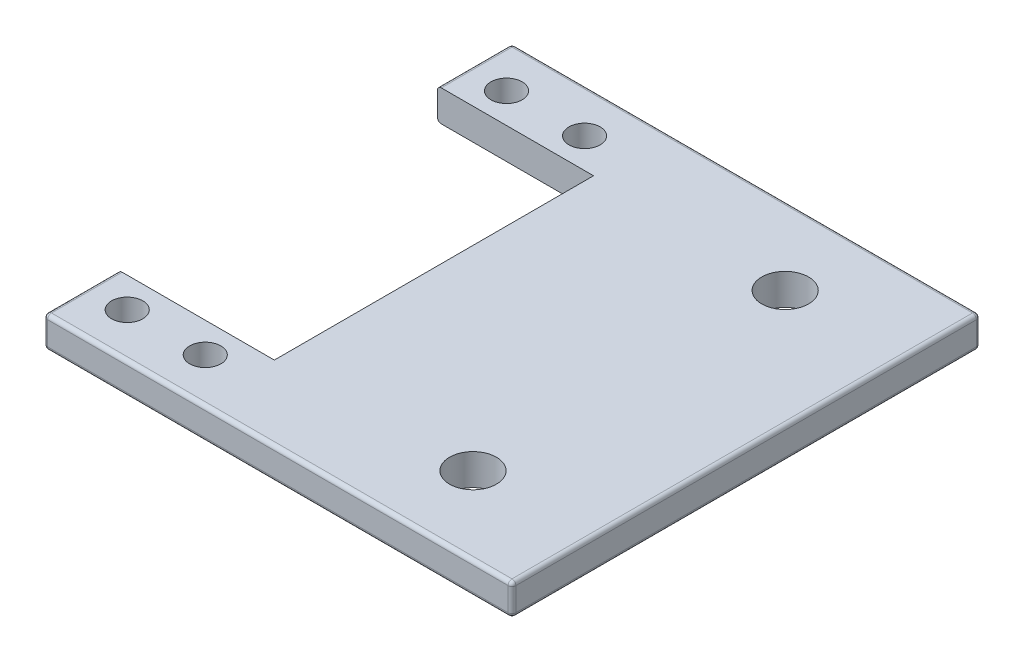
ISO-10303-21;
HEADER;
FILE_DESCRIPTION(('STEP AP214'),'2;1');
FILE_NAME('part.step','',(''),(''),'','','');
FILE_SCHEMA(('AUTOMOTIVE_DESIGN { 1 0 10303 214 1 1 1 1 }'));
ENDSEC;
DATA;
#1=APPLICATION_CONTEXT('core data for automotive mechanical design processes');
#2=APPLICATION_PROTOCOL_DEFINITION('international standard','automotive_design',2000,#1);
#3=PRODUCT_CONTEXT('',#1,'mechanical');
#4=PRODUCT('Part','Part','',(#3));
#5=PRODUCT_RELATED_PRODUCT_CATEGORY('part','',(#4));
#6=PRODUCT_DEFINITION_FORMATION('','',#4);
#7=PRODUCT_DEFINITION_CONTEXT('part definition',#1,'design');
#8=PRODUCT_DEFINITION('design','',#6,#7);
#9=PRODUCT_DEFINITION_SHAPE('','',#8);
#10=(LENGTH_UNIT() NAMED_UNIT(*) SI_UNIT(.MILLI.,.METRE.));
#11=(NAMED_UNIT(*) PLANE_ANGLE_UNIT() SI_UNIT($,.RADIAN.));
#12=(NAMED_UNIT(*) SI_UNIT($,.STERADIAN.) SOLID_ANGLE_UNIT());
#13=UNCERTAINTY_MEASURE_WITH_UNIT(LENGTH_MEASURE(1.E-05),#10,'distance_accuracy_value','');
#14=(GEOMETRIC_REPRESENTATION_CONTEXT(3) GLOBAL_UNCERTAINTY_ASSIGNED_CONTEXT((#13)) GLOBAL_UNIT_ASSIGNED_CONTEXT((#10,
#11,#12)) REPRESENTATION_CONTEXT('',''));
#15=CARTESIAN_POINT('',(0.,0.,0.));
#16=DIRECTION('',(0.,0.,1.));
#17=DIRECTION('',(1.,0.,0.));
#18=AXIS2_PLACEMENT_3D('',#15,#16,#17);
#19=CARTESIAN_POINT('',(0.,2.,-20.45));
#20=DIRECTION('',(0.,0.,-1.));
#21=DIRECTION('',(-1.,0.,0.));
#22=AXIS2_PLACEMENT_3D('',#19,#20,#21);
#23=PLANE('',#22);
#24=DIRECTION('',(0.,-1.,0.));
#25=VECTOR('',#24,1.);
#26=CARTESIAN_POINT('',(-30.,2.,-20.45));
#27=LINE('',#26,#25);
#28=CARTESIAN_POINT('',(-30.,1.5,-20.45));
#29=VERTEX_POINT('',#28);
#30=CARTESIAN_POINT('',(-30.,-1.5,-20.45));
#31=VERTEX_POINT('',#30);
#32=EDGE_CURVE('E364',#29,#31,#27,.T.);
#33=ORIENTED_EDGE('',*,*,#32,.T.);
#34=CARTESIAN_POINT('',(-29.5,-1.5,-20.45));
#35=DIRECTION('',(0.,0.,-1.));
#36=DIRECTION('',(-1.,0.,0.));
#37=AXIS2_PLACEMENT_3D('',#34,#35,#36);
#38=CIRCLE('',#37,0.5);
#39=CARTESIAN_POINT('',(-29.5,-2.,-20.45));
#40=VERTEX_POINT('',#39);
#41=EDGE_CURVE('E11',#31,#40,#38,.F.);
#42=ORIENTED_EDGE('',*,*,#41,.T.);
#43=DIRECTION('',(1.,0.,0.));
#44=VECTOR('',#43,1.);
#45=CARTESIAN_POINT('',(0.,-2.,-20.45));
#46=LINE('',#45,#44);
#47=CARTESIAN_POINT('',(-10.,-2.,-20.45));
#48=VERTEX_POINT('',#47);
#49=EDGE_CURVE('E194',#40,#48,#46,.T.);
#50=ORIENTED_EDGE('',*,*,#49,.T.);
#51=DIRECTION('',(0.,-1.,0.));
#52=VECTOR('',#51,1.);
#53=CARTESIAN_POINT('',(-10.,2.,-20.45));
#54=LINE('',#53,#52);
#55=CARTESIAN_POINT('',(-10.,2.,-20.45));
#56=VERTEX_POINT('',#55);
#57=EDGE_CURVE('E187',#56,#48,#54,.T.);
#58=ORIENTED_EDGE('',*,*,#57,.F.);
#59=DIRECTION('',(1.,0.,0.));
#60=VECTOR('',#59,1.);
#61=CARTESIAN_POINT('',(0.,2.,-20.45));
#62=LINE('',#61,#60);
#63=CARTESIAN_POINT('',(-29.5,2.,-20.45));
#64=VERTEX_POINT('',#63);
#65=EDGE_CURVE('E170',#64,#56,#62,.T.);
#66=ORIENTED_EDGE('',*,*,#65,.F.);
#67=CARTESIAN_POINT('',(-29.5,1.5,-20.45));
#68=DIRECTION('',(0.,0.,-1.));
#69=DIRECTION('',(-1.,0.,0.));
#70=AXIS2_PLACEMENT_3D('',#67,#68,#69);
#71=CIRCLE('',#70,0.5);
#72=EDGE_CURVE('E54',#64,#29,#71,.F.);
#73=ORIENTED_EDGE('',*,*,#72,.T.);
#74=EDGE_LOOP('',(#33,#42,#50,#58,#66,#73));
#75=FACE_BOUND('',#74,.T.);
#76=ADVANCED_FACE('F45',(#75),#23,.F.);
#77=CARTESIAN_POINT('',(-10.,2.,0.));
#78=DIRECTION('',(1.,0.,0.));
#79=DIRECTION('',(0.,0.,-1.));
#80=AXIS2_PLACEMENT_3D('',#77,#78,#79);
#81=PLANE('',#80);
#82=DIRECTION('',(0.,0.,1.));
#83=VECTOR('',#82,1.);
#84=CARTESIAN_POINT('',(-10.,-2.,0.));
#85=LINE('',#84,#83);
#86=CARTESIAN_POINT('',(-10.,-2.,20.45));
#87=VERTEX_POINT('',#86);
#88=EDGE_CURVE('E359',#48,#87,#85,.T.);
#89=ORIENTED_EDGE('',*,*,#88,.T.);
#90=DIRECTION('',(0.,-1.,0.));
#91=VECTOR('',#90,1.);
#92=CARTESIAN_POINT('',(-10.,2.,20.45));
#93=LINE('',#92,#91);
#94=CARTESIAN_POINT('',(-10.,2.,20.45));
#95=VERTEX_POINT('',#94);
#96=EDGE_CURVE('E189',#95,#87,#93,.T.);
#97=ORIENTED_EDGE('',*,*,#96,.F.);
#98=DIRECTION('',(0.,0.,1.));
#99=VECTOR('',#98,1.);
#100=CARTESIAN_POINT('',(-10.,2.,0.));
#101=LINE('',#100,#99);
#102=EDGE_CURVE('E174',#56,#95,#101,.T.);
#103=ORIENTED_EDGE('',*,*,#102,.F.);
#104=ORIENTED_EDGE('',*,*,#57,.T.);
#105=EDGE_LOOP('',(#89,#97,#103,#104));
#106=FACE_BOUND('',#105,.T.);
#107=ADVANCED_FACE('F186',(#106),#81,.F.);
#108=CARTESIAN_POINT('',(0.,2.,20.45));
#109=DIRECTION('',(0.,0.,-1.));
#110=DIRECTION('',(-1.,0.,0.));
#111=AXIS2_PLACEMENT_3D('',#108,#109,#110);
#112=PLANE('',#111);
#113=DIRECTION('',(1.,0.,0.));
#114=VECTOR('',#113,1.);
#115=CARTESIAN_POINT('',(0.,-2.,20.45));
#116=LINE('',#115,#114);
#117=CARTESIAN_POINT('',(-29.5,-2.,20.45));
#118=VERTEX_POINT('',#117);
#119=EDGE_CURVE('E361',#118,#87,#116,.T.);
#120=ORIENTED_EDGE('',*,*,#119,.F.);
#121=CARTESIAN_POINT('',(-29.5,-1.5,20.45));
#122=DIRECTION('',(0.,0.,-1.));
#123=DIRECTION('',(-1.,0.,0.));
#124=AXIS2_PLACEMENT_3D('',#121,#122,#123);
#125=CIRCLE('',#124,0.5);
#126=CARTESIAN_POINT('',(-30.,-1.5,20.45));
#127=VERTEX_POINT('',#126);
#128=EDGE_CURVE('E260',#118,#127,#125,.T.);
#129=ORIENTED_EDGE('',*,*,#128,.T.);
#130=DIRECTION('',(0.,-1.,0.));
#131=VECTOR('',#130,1.);
#132=CARTESIAN_POINT('',(-30.,2.,20.45));
#133=LINE('',#132,#131);
#134=CARTESIAN_POINT('',(-30.,1.5,20.45));
#135=VERTEX_POINT('',#134);
#136=EDGE_CURVE('E199',#135,#127,#133,.T.);
#137=ORIENTED_EDGE('',*,*,#136,.F.);
#138=CARTESIAN_POINT('',(-29.5,1.5,20.45));
#139=DIRECTION('',(0.,0.,-1.));
#140=DIRECTION('',(-1.,0.,0.));
#141=AXIS2_PLACEMENT_3D('',#138,#139,#140);
#142=CIRCLE('',#141,0.5);
#143=CARTESIAN_POINT('',(-29.5,2.,20.45));
#144=VERTEX_POINT('',#143);
#145=EDGE_CURVE('E258',#135,#144,#142,.T.);
#146=ORIENTED_EDGE('',*,*,#145,.T.);
#147=DIRECTION('',(1.,0.,0.));
#148=VECTOR('',#147,1.);
#149=CARTESIAN_POINT('',(0.,2.,20.45));
#150=LINE('',#149,#148);
#151=EDGE_CURVE('E190',#144,#95,#150,.T.);
#152=ORIENTED_EDGE('',*,*,#151,.T.);
#153=ORIENTED_EDGE('',*,*,#96,.T.);
#154=EDGE_LOOP('',(#120,#129,#137,#146,#152,#153));
#155=FACE_BOUND('',#154,.T.);
#156=ADVANCED_FACE('F388',(#155),#112,.T.);
#157=CARTESIAN_POINT('',(-30.,2.,0.));
#158=DIRECTION('',(-1.,0.,0.));
#159=DIRECTION('',(0.,0.,1.));
#160=AXIS2_PLACEMENT_3D('',#157,#158,#159);
#161=PLANE('',#160);
#162=ORIENTED_EDGE('',*,*,#136,.T.);
#163=DIRECTION('',(0.,0.,-1.));
#164=VECTOR('',#163,1.);
#165=CARTESIAN_POINT('',(-30.,-1.5,30.));
#166=LINE('',#165,#164);
#167=CARTESIAN_POINT('',(-30.,-1.5,29.5));
#168=VERTEX_POINT('',#167);
#169=EDGE_CURVE('E243',#127,#168,#166,.F.);
#170=ORIENTED_EDGE('',*,*,#169,.T.);
#171=DIRECTION('',(0.,-1.,0.));
#172=VECTOR('',#171,1.);
#173=CARTESIAN_POINT('',(-30.,2.,29.5));
#174=LINE('',#173,#172);
#175=CARTESIAN_POINT('',(-30.,1.5,29.5));
#176=VERTEX_POINT('',#175);
#177=EDGE_CURVE('E241',#168,#176,#174,.F.);
#178=ORIENTED_EDGE('',*,*,#177,.T.);
#179=DIRECTION('',(0.,0.,-1.));
#180=VECTOR('',#179,1.);
#181=CARTESIAN_POINT('',(-30.,1.5,0.));
#182=LINE('',#181,#180);
#183=EDGE_CURVE('E239',#176,#135,#182,.T.);
#184=ORIENTED_EDGE('',*,*,#183,.T.);
#185=EDGE_LOOP('',(#162,#170,#178,#184));
#186=FACE_BOUND('',#185,.T.);
#187=ADVANCED_FACE('F369',(#186),#161,.T.);
#188=CARTESIAN_POINT('',(0.,2.,30.));
#189=DIRECTION('',(0.,0.,-1.));
#190=DIRECTION('',(-1.,0.,0.));
#191=AXIS2_PLACEMENT_3D('',#188,#189,#190);
#192=PLANE('',#191);
#193=DIRECTION('',(1.,0.,0.));
#194=VECTOR('',#193,1.);
#195=CARTESIAN_POINT('',(-30.,1.5,30.));
#196=LINE('',#195,#194);
#197=CARTESIAN_POINT('',(29.5,1.5,30.));
#198=VERTEX_POINT('',#197);
#199=CARTESIAN_POINT('',(-29.5,1.5,30.));
#200=VERTEX_POINT('',#199);
#201=EDGE_CURVE('E234',#198,#200,#196,.F.);
#202=ORIENTED_EDGE('',*,*,#201,.T.);
#203=DIRECTION('',(0.,-1.,0.));
#204=VECTOR('',#203,1.);
#205=CARTESIAN_POINT('',(-29.5,-2.,30.));
#206=LINE('',#205,#204);
#207=CARTESIAN_POINT('',(-29.5,-1.5,30.));
#208=VERTEX_POINT('',#207);
#209=EDGE_CURVE('E236',#200,#208,#206,.T.);
#210=ORIENTED_EDGE('',*,*,#209,.T.);
#211=DIRECTION('',(1.,0.,0.));
#212=VECTOR('',#211,1.);
#213=CARTESIAN_POINT('',(0.,-1.5,30.));
#214=LINE('',#213,#212);
#215=CARTESIAN_POINT('',(29.5,-1.5,30.));
#216=VERTEX_POINT('',#215);
#217=EDGE_CURVE('E230',#208,#216,#214,.T.);
#218=ORIENTED_EDGE('',*,*,#217,.T.);
#219=DIRECTION('',(0.,-1.,0.));
#220=VECTOR('',#219,1.);
#221=CARTESIAN_POINT('',(29.5,2.,30.));
#222=LINE('',#221,#220);
#223=EDGE_CURVE('E232',#216,#198,#222,.F.);
#224=ORIENTED_EDGE('',*,*,#223,.T.);
#225=EDGE_LOOP('',(#202,#210,#218,#224));
#226=FACE_BOUND('',#225,.T.);
#227=ADVANCED_FACE('F465',(#226),#192,.F.);
#228=CARTESIAN_POINT('',(30.,2.,0.));
#229=DIRECTION('',(-1.,0.,0.));
#230=DIRECTION('',(0.,0.,1.));
#231=AXIS2_PLACEMENT_3D('',#228,#229,#230);
#232=PLANE('',#231);
#233=DIRECTION('',(0.,0.,-1.));
#234=VECTOR('',#233,1.);
#235=CARTESIAN_POINT('',(30.,1.5,30.));
#236=LINE('',#235,#234);
#237=CARTESIAN_POINT('',(30.,1.5,-29.5));
#238=VERTEX_POINT('',#237);
#239=CARTESIAN_POINT('',(30.,1.5,29.5));
#240=VERTEX_POINT('',#239);
#241=EDGE_CURVE('E215',#238,#240,#236,.F.);
#242=ORIENTED_EDGE('',*,*,#241,.T.);
#243=DIRECTION('',(0.,-1.,0.));
#244=VECTOR('',#243,1.);
#245=CARTESIAN_POINT('',(30.,2.,29.5));
#246=LINE('',#245,#244);
#247=CARTESIAN_POINT('',(30.,-1.5,29.5));
#248=VERTEX_POINT('',#247);
#249=EDGE_CURVE('E218',#240,#248,#246,.T.);
#250=ORIENTED_EDGE('',*,*,#249,.T.);
#251=DIRECTION('',(0.,0.,-1.));
#252=VECTOR('',#251,1.);
#253=CARTESIAN_POINT('',(30.,-1.5,0.));
#254=LINE('',#253,#252);
#255=CARTESIAN_POINT('',(30.,-1.5,-29.5));
#256=VERTEX_POINT('',#255);
#257=EDGE_CURVE('E213',#248,#256,#254,.T.);
#258=ORIENTED_EDGE('',*,*,#257,.T.);
#259=DIRECTION('',(0.,-1.,0.));
#260=VECTOR('',#259,1.);
#261=CARTESIAN_POINT('',(30.,2.,-29.5));
#262=LINE('',#261,#260);
#263=EDGE_CURVE('E211',#256,#238,#262,.F.);
#264=ORIENTED_EDGE('',*,*,#263,.T.);
#265=EDGE_LOOP('',(#242,#250,#258,#264));
#266=FACE_BOUND('',#265,.T.);
#267=ADVANCED_FACE('F585',(#266),#232,.F.);
#268=CARTESIAN_POINT('',(0.,2.,-30.));
#269=DIRECTION('',(0.,0.,-1.));
#270=DIRECTION('',(-1.,0.,0.));
#271=AXIS2_PLACEMENT_3D('',#268,#269,#270);
#272=PLANE('',#271);
#273=DIRECTION('',(1.,0.,0.));
#274=VECTOR('',#273,1.);
#275=CARTESIAN_POINT('',(0.,1.5,-30.));
#276=LINE('',#275,#274);
#277=CARTESIAN_POINT('',(-29.5,1.5,-30.));
#278=VERTEX_POINT('',#277);
#279=CARTESIAN_POINT('',(29.5,1.5,-30.));
#280=VERTEX_POINT('',#279);
#281=EDGE_CURVE('E249',#278,#280,#276,.T.);
#282=ORIENTED_EDGE('',*,*,#281,.T.);
#283=DIRECTION('',(0.,-1.,0.));
#284=VECTOR('',#283,1.);
#285=CARTESIAN_POINT('',(29.5,-2.,-30.));
#286=LINE('',#285,#284);
#287=CARTESIAN_POINT('',(29.5,-1.5,-30.));
#288=VERTEX_POINT('',#287);
#289=EDGE_CURVE('E251',#280,#288,#286,.T.);
#290=ORIENTED_EDGE('',*,*,#289,.T.);
#291=DIRECTION('',(1.,0.,0.));
#292=VECTOR('',#291,1.);
#293=CARTESIAN_POINT('',(-30.,-1.5,-30.));
#294=LINE('',#293,#292);
#295=CARTESIAN_POINT('',(-29.5,-1.5,-30.));
#296=VERTEX_POINT('',#295);
#297=EDGE_CURVE('E245',#288,#296,#294,.F.);
#298=ORIENTED_EDGE('',*,*,#297,.T.);
#299=DIRECTION('',(0.,-1.,0.));
#300=VECTOR('',#299,1.);
#301=CARTESIAN_POINT('',(-29.5,2.,-30.));
#302=LINE('',#301,#300);
#303=EDGE_CURVE('E247',#296,#278,#302,.F.);
#304=ORIENTED_EDGE('',*,*,#303,.T.);
#305=EDGE_LOOP('',(#282,#290,#298,#304));
#306=FACE_BOUND('',#305,.T.);
#307=ADVANCED_FACE('F478',(#306),#272,.T.);
#308=CARTESIAN_POINT('',(-25.,2.,-24.3));
#309=DIRECTION('',(0.,-1.,0.));
#310=DIRECTION('',(0.,0.,-1.));
#311=AXIS2_PLACEMENT_3D('',#308,#309,#310);
#312=CYLINDRICAL_SURFACE('',#311,2.00000000000001);
#313=CARTESIAN_POINT('',(-25.,2.,-24.3));
#314=DIRECTION('',(0.,1.,0.));
#315=DIRECTION('',(0.,0.,1.));
#316=AXIS2_PLACEMENT_3D('',#313,#314,#315);
#317=CIRCLE('',#316,2.00000000000001);
#318=CARTESIAN_POINT('',(-25.,2.,-22.3));
#319=VERTEX_POINT('',#318);
#320=EDGE_CURVE('E181',#319,#319,#317,.T.);
#321=ORIENTED_EDGE('',*,*,#320,.T.);
#322=EDGE_LOOP('',(#321));
#323=FACE_BOUND('',#322,.T.);
#324=CARTESIAN_POINT('',(-25.,-2.,-24.3));
#325=DIRECTION('',(0.,1.,0.));
#326=DIRECTION('',(0.,0.,1.));
#327=AXIS2_PLACEMENT_3D('',#324,#325,#326);
#328=CIRCLE('',#327,2.00000000000001);
#329=CARTESIAN_POINT('',(-25.,-2.,-22.3));
#330=VERTEX_POINT('',#329);
#331=EDGE_CURVE('E355',#330,#330,#328,.T.);
#332=ORIENTED_EDGE('',*,*,#331,.F.);
#333=EDGE_LOOP('',(#332));
#334=FACE_BOUND('',#333,.T.);
#335=ADVANCED_FACE('F474',(#323,#334),#312,.F.);
#336=CARTESIAN_POINT('',(-15.,2.,-24.3));
#337=DIRECTION('',(0.,-1.,0.));
#338=DIRECTION('',(0.,0.,-1.));
#339=AXIS2_PLACEMENT_3D('',#336,#337,#338);
#340=CYLINDRICAL_SURFACE('',#339,2.);
#341=CARTESIAN_POINT('',(-15.,2.,-24.3));
#342=DIRECTION('',(0.,1.,0.));
#343=DIRECTION('',(0.,0.,1.));
#344=AXIS2_PLACEMENT_3D('',#341,#342,#343);
#345=CIRCLE('',#344,2.);
#346=CARTESIAN_POINT('',(-15.,2.,-22.3));
#347=VERTEX_POINT('',#346);
#348=EDGE_CURVE('E885',#347,#347,#345,.T.);
#349=ORIENTED_EDGE('',*,*,#348,.T.);
#350=EDGE_LOOP('',(#349));
#351=FACE_BOUND('',#350,.T.);
#352=CARTESIAN_POINT('',(-15.,-2.,-24.3));
#353=DIRECTION('',(0.,1.,0.));
#354=DIRECTION('',(0.,0.,1.));
#355=AXIS2_PLACEMENT_3D('',#352,#353,#354);
#356=CIRCLE('',#355,2.);
#357=CARTESIAN_POINT('',(-15.,-2.,-22.3));
#358=VERTEX_POINT('',#357);
#359=EDGE_CURVE('E352',#358,#358,#356,.T.);
#360=ORIENTED_EDGE('',*,*,#359,.F.);
#361=EDGE_LOOP('',(#360));
#362=FACE_BOUND('',#361,.T.);
#363=ADVANCED_FACE('F477',(#351,#362),#340,.F.);
#364=CARTESIAN_POINT('',(-25.,2.,24.3));
#365=DIRECTION('',(0.,-1.,0.));
#366=DIRECTION('',(0.,0.,-1.));
#367=AXIS2_PLACEMENT_3D('',#364,#365,#366);
#368=CYLINDRICAL_SURFACE('',#367,2.00000000000001);
#369=CARTESIAN_POINT('',(-25.,2.,24.3));
#370=DIRECTION('',(0.,1.,0.));
#371=DIRECTION('',(0.,0.,1.));
#372=AXIS2_PLACEMENT_3D('',#369,#370,#371);
#373=CIRCLE('',#372,2.00000000000001);
#374=CARTESIAN_POINT('',(-25.,2.,26.3));
#375=VERTEX_POINT('',#374);
#376=EDGE_CURVE('E878',#375,#375,#373,.T.);
#377=ORIENTED_EDGE('',*,*,#376,.T.);
#378=EDGE_LOOP('',(#377));
#379=FACE_BOUND('',#378,.T.);
#380=CARTESIAN_POINT('',(-25.,-2.,24.3));
#381=DIRECTION('',(0.,1.,0.));
#382=DIRECTION('',(0.,0.,1.));
#383=AXIS2_PLACEMENT_3D('',#380,#381,#382);
#384=CIRCLE('',#383,2.00000000000001);
#385=CARTESIAN_POINT('',(-25.,-2.,26.3));
#386=VERTEX_POINT('',#385);
#387=EDGE_CURVE('E349',#386,#386,#384,.T.);
#388=ORIENTED_EDGE('',*,*,#387,.F.);
#389=EDGE_LOOP('',(#388));
#390=FACE_BOUND('',#389,.T.);
#391=ADVANCED_FACE('F482',(#379,#390),#368,.F.);
#392=CARTESIAN_POINT('',(-15.,2.,24.3));
#393=DIRECTION('',(0.,-1.,0.));
#394=DIRECTION('',(0.,0.,-1.));
#395=AXIS2_PLACEMENT_3D('',#392,#393,#394);
#396=CYLINDRICAL_SURFACE('',#395,2.);
#397=CARTESIAN_POINT('',(-15.,2.,24.3));
#398=DIRECTION('',(0.,1.,0.));
#399=DIRECTION('',(0.,0.,1.));
#400=AXIS2_PLACEMENT_3D('',#397,#398,#399);
#401=CIRCLE('',#400,2.);
#402=CARTESIAN_POINT('',(-15.,2.,26.3));
#403=VERTEX_POINT('',#402);
#404=EDGE_CURVE('E875',#403,#403,#401,.T.);
#405=ORIENTED_EDGE('',*,*,#404,.T.);
#406=EDGE_LOOP('',(#405));
#407=FACE_BOUND('',#406,.T.);
#408=CARTESIAN_POINT('',(-15.,-2.,24.3));
#409=DIRECTION('',(0.,1.,0.));
#410=DIRECTION('',(0.,0.,1.));
#411=AXIS2_PLACEMENT_3D('',#408,#409,#410);
#412=CIRCLE('',#411,2.);
#413=CARTESIAN_POINT('',(-15.,-2.,26.3));
#414=VERTEX_POINT('',#413);
#415=EDGE_CURVE('E343',#414,#414,#412,.T.);
#416=ORIENTED_EDGE('',*,*,#415,.F.);
#417=EDGE_LOOP('',(#416));
#418=FACE_BOUND('',#417,.T.);
#419=ADVANCED_FACE('F486',(#407,#418),#396,.F.);
#420=CARTESIAN_POINT('',(15.,2.,-20.));
#421=DIRECTION('',(0.,-1.,0.));
#422=DIRECTION('',(0.,0.,-1.));
#423=AXIS2_PLACEMENT_3D('',#420,#421,#422);
#424=CYLINDRICAL_SURFACE('',#423,3.);
#425=CARTESIAN_POINT('',(15.,2.,-20.));
#426=DIRECTION('',(0.,1.,0.));
#427=DIRECTION('',(0.,0.,1.));
#428=AXIS2_PLACEMENT_3D('',#425,#426,#427);
#429=CIRCLE('',#428,3.);
#430=CARTESIAN_POINT('',(15.,2.,-17.));
#431=VERTEX_POINT('',#430);
#432=EDGE_CURVE('E873',#431,#431,#429,.T.);
#433=ORIENTED_EDGE('',*,*,#432,.T.);
#434=EDGE_LOOP('',(#433));
#435=FACE_BOUND('',#434,.T.);
#436=CARTESIAN_POINT('',(15.,-2.,-20.));
#437=DIRECTION('',(0.,1.,0.));
#438=DIRECTION('',(0.,0.,1.));
#439=AXIS2_PLACEMENT_3D('',#436,#437,#438);
#440=CIRCLE('',#439,3.);
#441=CARTESIAN_POINT('',(15.,-2.,-17.));
#442=VERTEX_POINT('',#441);
#443=EDGE_CURVE('E338',#442,#442,#440,.T.);
#444=ORIENTED_EDGE('',*,*,#443,.F.);
#445=EDGE_LOOP('',(#444));
#446=FACE_BOUND('',#445,.T.);
#447=ADVANCED_FACE('F459',(#435,#446),#424,.F.);
#448=CARTESIAN_POINT('',(15.,2.,20.));
#449=DIRECTION('',(0.,-1.,0.));
#450=DIRECTION('',(0.,0.,-1.));
#451=AXIS2_PLACEMENT_3D('',#448,#449,#450);
#452=CYLINDRICAL_SURFACE('',#451,3.);
#453=CARTESIAN_POINT('',(15.,2.,20.));
#454=DIRECTION('',(0.,1.,0.));
#455=DIRECTION('',(0.,0.,1.));
#456=AXIS2_PLACEMENT_3D('',#453,#454,#455);
#457=CIRCLE('',#456,3.);
#458=CARTESIAN_POINT('',(15.,2.,23.));
#459=VERTEX_POINT('',#458);
#460=EDGE_CURVE('E363',#459,#459,#457,.T.);
#461=ORIENTED_EDGE('',*,*,#460,.T.);
#462=EDGE_LOOP('',(#461));
#463=FACE_BOUND('',#462,.T.);
#464=CARTESIAN_POINT('',(15.,-2.,20.));
#465=DIRECTION('',(0.,1.,0.));
#466=DIRECTION('',(0.,0.,1.));
#467=AXIS2_PLACEMENT_3D('',#464,#465,#466);
#468=CIRCLE('',#467,3.);
#469=CARTESIAN_POINT('',(15.,-2.,23.));
#470=VERTEX_POINT('',#469);
#471=EDGE_CURVE('E332',#470,#470,#468,.T.);
#472=ORIENTED_EDGE('',*,*,#471,.F.);
#473=EDGE_LOOP('',(#472));
#474=FACE_BOUND('',#473,.T.);
#475=ADVANCED_FACE('F451',(#463,#474),#452,.F.);
#476=DIRECTION('',(0.,-1.,0.));
#477=VECTOR('',#476,1.);
#478=CARTESIAN_POINT('',(-30.,2.,-29.5));
#479=LINE('',#478,#477);
#480=CARTESIAN_POINT('',(-30.,1.5,-29.5));
#481=VERTEX_POINT('',#480);
#482=CARTESIAN_POINT('',(-30.,-1.5,-29.5));
#483=VERTEX_POINT('',#482);
#484=EDGE_CURVE('E62',#481,#483,#479,.T.);
#485=ORIENTED_EDGE('',*,*,#484,.T.);
#486=DIRECTION('',(0.,0.,-1.));
#487=VECTOR('',#486,1.);
#488=CARTESIAN_POINT('',(-30.,-1.5,-20.45));
#489=LINE('',#488,#487);
#490=EDGE_CURVE('E256',#483,#31,#489,.F.);
#491=ORIENTED_EDGE('',*,*,#490,.T.);
#492=ORIENTED_EDGE('',*,*,#32,.F.);
#493=DIRECTION('',(0.,0.,-1.));
#494=VECTOR('',#493,1.);
#495=CARTESIAN_POINT('',(-30.,1.5,0.));
#496=LINE('',#495,#494);
#497=EDGE_CURVE('E67',#29,#481,#496,.T.);
#498=ORIENTED_EDGE('',*,*,#497,.T.);
#499=EDGE_LOOP('',(#485,#491,#492,#498));
#500=FACE_BOUND('',#499,.T.);
#501=ADVANCED_FACE('F449',(#500),#161,.T.);
#502=CARTESIAN_POINT('',(0.,2.,0.));
#503=DIRECTION('',(0.,1.,0.));
#504=DIRECTION('',(0.,0.,1.));
#505=AXIS2_PLACEMENT_3D('',#502,#503,#504);
#506=PLANE('',#505);
#507=ORIENTED_EDGE('',*,*,#460,.F.);
#508=EDGE_LOOP('',(#507));
#509=FACE_BOUND('',#508,.T.);
#510=ORIENTED_EDGE('',*,*,#432,.F.);
#511=EDGE_LOOP('',(#510));
#512=FACE_BOUND('',#511,.T.);
#513=ORIENTED_EDGE('',*,*,#404,.F.);
#514=EDGE_LOOP('',(#513));
#515=FACE_BOUND('',#514,.T.);
#516=ORIENTED_EDGE('',*,*,#376,.F.);
#517=EDGE_LOOP('',(#516));
#518=FACE_BOUND('',#517,.T.);
#519=ORIENTED_EDGE('',*,*,#348,.F.);
#520=EDGE_LOOP('',(#519));
#521=FACE_BOUND('',#520,.T.);
#522=ORIENTED_EDGE('',*,*,#320,.F.);
#523=EDGE_LOOP('',(#522));
#524=FACE_BOUND('',#523,.T.);
#525=ORIENTED_EDGE('',*,*,#151,.F.);
#526=DIRECTION('',(0.,0.,-1.));
#527=VECTOR('',#526,1.);
#528=CARTESIAN_POINT('',(-29.5,2.,0.));
#529=LINE('',#528,#527);
#530=CARTESIAN_POINT('',(-29.5,2.,29.5));
#531=VERTEX_POINT('',#530);
#532=EDGE_CURVE('E209',#144,#531,#529,.F.);
#533=ORIENTED_EDGE('',*,*,#532,.T.);
#534=DIRECTION('',(1.,0.,0.));
#535=VECTOR('',#534,1.);
#536=CARTESIAN_POINT('',(30.,2.,29.5));
#537=LINE('',#536,#535);
#538=CARTESIAN_POINT('',(29.5,2.,29.5));
#539=VERTEX_POINT('',#538);
#540=EDGE_CURVE('E207',#531,#539,#537,.T.);
#541=ORIENTED_EDGE('',*,*,#540,.T.);
#542=DIRECTION('',(0.,0.,-1.));
#543=VECTOR('',#542,1.);
#544=CARTESIAN_POINT('',(29.5,2.,-30.));
#545=LINE('',#544,#543);
#546=CARTESIAN_POINT('',(29.5,2.,-29.5));
#547=VERTEX_POINT('',#546);
#548=EDGE_CURVE('E204',#539,#547,#545,.T.);
#549=ORIENTED_EDGE('',*,*,#548,.T.);
#550=DIRECTION('',(1.,0.,0.));
#551=VECTOR('',#550,1.);
#552=CARTESIAN_POINT('',(0.,2.,-29.5));
#553=LINE('',#552,#551);
#554=CARTESIAN_POINT('',(-29.5,2.,-29.5));
#555=VERTEX_POINT('',#554);
#556=EDGE_CURVE('E197',#547,#555,#553,.F.);
#557=ORIENTED_EDGE('',*,*,#556,.T.);
#558=DIRECTION('',(0.,0.,-1.));
#559=VECTOR('',#558,1.);
#560=CARTESIAN_POINT('',(-29.5,2.,0.));
#561=LINE('',#560,#559);
#562=EDGE_CURVE('E177',#555,#64,#561,.F.);
#563=ORIENTED_EDGE('',*,*,#562,.T.);
#564=ORIENTED_EDGE('',*,*,#65,.T.);
#565=ORIENTED_EDGE('',*,*,#102,.T.);
#566=EDGE_LOOP('',(#525,#533,#541,#549,#557,#563,#564,#565));
#567=FACE_BOUND('',#566,.T.);
#568=ADVANCED_FACE('F173',(#509,#512,#515,#518,#521,#524,#567),#506,.T.);
#569=CARTESIAN_POINT('',(0.,-2.,0.));
#570=DIRECTION('',(0.,1.,0.));
#571=DIRECTION('',(0.,0.,1.));
#572=AXIS2_PLACEMENT_3D('',#569,#570,#571);
#573=PLANE('',#572);
#574=ORIENTED_EDGE('',*,*,#471,.T.);
#575=EDGE_LOOP('',(#574));
#576=FACE_BOUND('',#575,.T.);
#577=ORIENTED_EDGE('',*,*,#443,.T.);
#578=EDGE_LOOP('',(#577));
#579=FACE_BOUND('',#578,.T.);
#580=ORIENTED_EDGE('',*,*,#415,.T.);
#581=EDGE_LOOP('',(#580));
#582=FACE_BOUND('',#581,.T.);
#583=ORIENTED_EDGE('',*,*,#387,.T.);
#584=EDGE_LOOP('',(#583));
#585=FACE_BOUND('',#584,.T.);
#586=ORIENTED_EDGE('',*,*,#359,.T.);
#587=EDGE_LOOP('',(#586));
#588=FACE_BOUND('',#587,.T.);
#589=ORIENTED_EDGE('',*,*,#331,.T.);
#590=EDGE_LOOP('',(#589));
#591=FACE_BOUND('',#590,.T.);
#592=DIRECTION('',(1.,0.,0.));
#593=VECTOR('',#592,1.);
#594=CARTESIAN_POINT('',(0.,-2.,29.5));
#595=LINE('',#594,#593);
#596=CARTESIAN_POINT('',(29.5,-2.,29.5));
#597=VERTEX_POINT('',#596);
#598=CARTESIAN_POINT('',(-29.5,-2.,29.5));
#599=VERTEX_POINT('',#598);
#600=EDGE_CURVE('E226',#597,#599,#595,.F.);
#601=ORIENTED_EDGE('',*,*,#600,.T.);
#602=DIRECTION('',(0.,0.,-1.));
#603=VECTOR('',#602,1.);
#604=CARTESIAN_POINT('',(-29.5,-2.,20.45));
#605=LINE('',#604,#603);
#606=EDGE_CURVE('E228',#599,#118,#605,.T.);
#607=ORIENTED_EDGE('',*,*,#606,.T.);
#608=ORIENTED_EDGE('',*,*,#119,.T.);
#609=ORIENTED_EDGE('',*,*,#88,.F.);
#610=ORIENTED_EDGE('',*,*,#49,.F.);
#611=DIRECTION('',(0.,0.,-1.));
#612=VECTOR('',#611,1.);
#613=CARTESIAN_POINT('',(-29.5,-2.,-30.));
#614=LINE('',#613,#612);
#615=CARTESIAN_POINT('',(-29.5,-2.,-29.5));
#616=VERTEX_POINT('',#615);
#617=EDGE_CURVE('E220',#40,#616,#614,.T.);
#618=ORIENTED_EDGE('',*,*,#617,.T.);
#619=DIRECTION('',(1.,0.,0.));
#620=VECTOR('',#619,1.);
#621=CARTESIAN_POINT('',(30.,-2.,-29.5));
#622=LINE('',#621,#620);
#623=CARTESIAN_POINT('',(29.5,-2.,-29.5));
#624=VERTEX_POINT('',#623);
#625=EDGE_CURVE('E222',#616,#624,#622,.T.);
#626=ORIENTED_EDGE('',*,*,#625,.T.);
#627=DIRECTION('',(0.,0.,-1.));
#628=VECTOR('',#627,1.);
#629=CARTESIAN_POINT('',(29.5,-2.,0.));
#630=LINE('',#629,#628);
#631=EDGE_CURVE('E224',#624,#597,#630,.F.);
#632=ORIENTED_EDGE('',*,*,#631,.T.);
#633=EDGE_LOOP('',(#601,#607,#608,#609,#610,#618,#626,#632));
#634=FACE_BOUND('',#633,.T.);
#635=ADVANCED_FACE('F430',(#576,#579,#582,#585,#588,#591,#634),#573,.F.);
#636=CARTESIAN_POINT('',(-29.5,-1.5,0.));
#637=DIRECTION('',(0.,0.,1.));
#638=DIRECTION('',(1.,0.,0.));
#639=AXIS2_PLACEMENT_3D('',#636,#637,#638);
#640=CYLINDRICAL_SURFACE('',#639,0.5);
#641=ORIENTED_EDGE('',*,*,#128,.F.);
#642=ORIENTED_EDGE('',*,*,#606,.F.);
#643=CARTESIAN_POINT('',(-29.5,-1.5,29.5));
#644=DIRECTION('',(0.,0.,1.));
#645=DIRECTION('',(1.,0.,0.));
#646=AXIS2_PLACEMENT_3D('',#643,#644,#645);
#647=CIRCLE('',#646,0.5);
#648=EDGE_CURVE('E49',#168,#599,#647,.T.);
#649=ORIENTED_EDGE('',*,*,#648,.F.);
#650=ORIENTED_EDGE('',*,*,#169,.F.);
#651=EDGE_LOOP('',(#641,#642,#649,#650));
#652=FACE_BOUND('',#651,.T.);
#653=ADVANCED_FACE('F47',(#652),#640,.T.);
#654=CARTESIAN_POINT('',(-29.5,-1.5,0.));
#655=DIRECTION('',(0.,0.,1.));
#656=DIRECTION('',(1.,0.,0.));
#657=AXIS2_PLACEMENT_3D('',#654,#655,#656);
#658=CYLINDRICAL_SURFACE('',#657,0.5);
#659=ORIENTED_EDGE('',*,*,#41,.F.);
#660=ORIENTED_EDGE('',*,*,#490,.F.);
#661=CARTESIAN_POINT('',(-29.5,-1.5,-29.5));
#662=DIRECTION('',(0.,0.,-1.));
#663=DIRECTION('',(-1.,0.,0.));
#664=AXIS2_PLACEMENT_3D('',#661,#662,#663);
#665=CIRCLE('',#664,0.5);
#666=EDGE_CURVE('E325',#616,#483,#665,.T.);
#667=ORIENTED_EDGE('',*,*,#666,.F.);
#668=ORIENTED_EDGE('',*,*,#617,.F.);
#669=EDGE_LOOP('',(#659,#660,#667,#668));
#670=FACE_BOUND('',#669,.T.);
#671=ADVANCED_FACE('F448',(#670),#658,.T.);
#672=CARTESIAN_POINT('',(-29.5,-1.5,29.5));
#673=DIRECTION('',(0.,-1.,0.));
#674=DIRECTION('',(0.,0.,-1.));
#675=AXIS2_PLACEMENT_3D('',#672,#673,#674);
#676=SPHERICAL_SURFACE('',#675,0.5);
#677=CARTESIAN_POINT('',(-29.5,-1.5,29.5));
#678=DIRECTION('',(0.,-1.,0.));
#679=DIRECTION('',(0.,0.,-1.));
#680=AXIS2_PLACEMENT_3D('',#677,#678,#679);
#681=CIRCLE('',#680,0.5);
#682=EDGE_CURVE('E320',#168,#208,#681,.F.);
#683=ORIENTED_EDGE('',*,*,#682,.F.);
#684=ORIENTED_EDGE('',*,*,#648,.T.);
#685=CARTESIAN_POINT('',(-29.5,-1.5,29.5));
#686=DIRECTION('',(-1.,0.,0.));
#687=DIRECTION('',(0.,0.,1.));
#688=AXIS2_PLACEMENT_3D('',#685,#686,#687);
#689=CIRCLE('',#688,0.5);
#690=EDGE_CURVE('E323',#208,#599,#689,.F.);
#691=ORIENTED_EDGE('',*,*,#690,.F.);
#692=EDGE_LOOP('',(#683,#684,#691));
#693=FACE_BOUND('',#692,.T.);
#694=ADVANCED_FACE('F377',(#693),#676,.T.);
#695=CARTESIAN_POINT('',(-29.5,-1.5,-29.5));
#696=DIRECTION('',(-1.,0.,0.));
#697=DIRECTION('',(0.,0.,1.));
#698=AXIS2_PLACEMENT_3D('',#695,#696,#697);
#699=SPHERICAL_SURFACE('',#698,0.5);
#700=CARTESIAN_POINT('',(-29.5,-1.5,-29.5));
#701=DIRECTION('',(-1.,0.,0.));
#702=DIRECTION('',(0.,0.,1.));
#703=AXIS2_PLACEMENT_3D('',#700,#701,#702);
#704=CIRCLE('',#703,0.5);
#705=EDGE_CURVE('E314',#616,#296,#704,.F.);
#706=ORIENTED_EDGE('',*,*,#705,.F.);
#707=ORIENTED_EDGE('',*,*,#666,.T.);
#708=CARTESIAN_POINT('',(-29.5,-1.5,-29.5));
#709=DIRECTION('',(0.,-1.,0.));
#710=DIRECTION('',(0.,0.,-1.));
#711=AXIS2_PLACEMENT_3D('',#708,#709,#710);
#712=CIRCLE('',#711,0.5);
#713=EDGE_CURVE('E317',#296,#483,#712,.F.);
#714=ORIENTED_EDGE('',*,*,#713,.F.);
#715=EDGE_LOOP('',(#706,#707,#714));
#716=FACE_BOUND('',#715,.T.);
#717=ADVANCED_FACE('F422',(#716),#699,.T.);
#718=CARTESIAN_POINT('',(0.,-1.5,29.5));
#719=DIRECTION('',(1.,0.,0.));
#720=DIRECTION('',(0.,0.,-1.));
#721=AXIS2_PLACEMENT_3D('',#718,#719,#720);
#722=CYLINDRICAL_SURFACE('',#721,0.5);
#723=ORIENTED_EDGE('',*,*,#690,.T.);
#724=ORIENTED_EDGE('',*,*,#600,.F.);
#725=CARTESIAN_POINT('',(29.5,-1.5,29.5));
#726=DIRECTION('',(1.,0.,0.));
#727=DIRECTION('',(0.,0.,-1.));
#728=AXIS2_PLACEMENT_3D('',#725,#726,#727);
#729=CIRCLE('',#728,0.5);
#730=EDGE_CURVE('E308',#216,#597,#729,.T.);
#731=ORIENTED_EDGE('',*,*,#730,.F.);
#732=ORIENTED_EDGE('',*,*,#217,.F.);
#733=EDGE_LOOP('',(#723,#724,#731,#732));
#734=FACE_BOUND('',#733,.T.);
#735=ADVANCED_FACE('F445',(#734),#722,.T.);
#736=CARTESIAN_POINT('',(-29.5,2.,29.5));
#737=DIRECTION('',(0.,1.,0.));
#738=DIRECTION('',(0.,0.,1.));
#739=AXIS2_PLACEMENT_3D('',#736,#737,#738);
#740=CYLINDRICAL_SURFACE('',#739,0.5);
#741=ORIENTED_EDGE('',*,*,#682,.T.);
#742=ORIENTED_EDGE('',*,*,#209,.F.);
#743=CARTESIAN_POINT('',(-29.5,1.5,29.5));
#744=DIRECTION('',(0.,1.,0.));
#745=DIRECTION('',(0.,0.,1.));
#746=AXIS2_PLACEMENT_3D('',#743,#744,#745);
#747=CIRCLE('',#746,0.5);
#748=EDGE_CURVE('E305',#176,#200,#747,.T.);
#749=ORIENTED_EDGE('',*,*,#748,.F.);
#750=ORIENTED_EDGE('',*,*,#177,.F.);
#751=EDGE_LOOP('',(#741,#742,#749,#750));
#752=FACE_BOUND('',#751,.T.);
#753=ADVANCED_FACE('F381',(#752),#740,.T.);
#754=CARTESIAN_POINT('',(-29.5,1.5,0.));
#755=DIRECTION('',(0.,0.,-1.));
#756=DIRECTION('',(-1.,0.,0.));
#757=AXIS2_PLACEMENT_3D('',#754,#755,#756);
#758=CYLINDRICAL_SURFACE('',#757,0.5);
#759=ORIENTED_EDGE('',*,*,#145,.F.);
#760=ORIENTED_EDGE('',*,*,#183,.F.);
#761=CARTESIAN_POINT('',(-29.5,1.5,29.5));
#762=DIRECTION('',(0.,0.,1.));
#763=DIRECTION('',(1.,0.,0.));
#764=AXIS2_PLACEMENT_3D('',#761,#762,#763);
#765=CIRCLE('',#764,0.5);
#766=EDGE_CURVE('E302',#531,#176,#765,.T.);
#767=ORIENTED_EDGE('',*,*,#766,.F.);
#768=ORIENTED_EDGE('',*,*,#532,.F.);
#769=EDGE_LOOP('',(#759,#760,#767,#768));
#770=FACE_BOUND('',#769,.T.);
#771=ADVANCED_FACE('F384',(#770),#758,.T.);
#772=CARTESIAN_POINT('',(-29.5,1.5,0.));
#773=DIRECTION('',(0.,0.,-1.));
#774=DIRECTION('',(-1.,0.,0.));
#775=AXIS2_PLACEMENT_3D('',#772,#773,#774);
#776=CYLINDRICAL_SURFACE('',#775,0.5);
#777=ORIENTED_EDGE('',*,*,#72,.F.);
#778=ORIENTED_EDGE('',*,*,#562,.F.);
#779=CARTESIAN_POINT('',(-29.5,1.5,-29.5));
#780=DIRECTION('',(0.,0.,-1.));
#781=DIRECTION('',(-1.,0.,0.));
#782=AXIS2_PLACEMENT_3D('',#779,#780,#781);
#783=CIRCLE('',#782,0.5);
#784=EDGE_CURVE('E299',#481,#555,#783,.T.);
#785=ORIENTED_EDGE('',*,*,#784,.F.);
#786=ORIENTED_EDGE('',*,*,#497,.F.);
#787=EDGE_LOOP('',(#777,#778,#785,#786));
#788=FACE_BOUND('',#787,.T.);
#789=ADVANCED_FACE('F415',(#788),#776,.T.);
#790=CARTESIAN_POINT('',(-29.5,2.,-29.5));
#791=DIRECTION('',(0.,-1.,0.));
#792=DIRECTION('',(0.,0.,-1.));
#793=AXIS2_PLACEMENT_3D('',#790,#791,#792);
#794=CYLINDRICAL_SURFACE('',#793,0.5);
#795=ORIENTED_EDGE('',*,*,#713,.T.);
#796=ORIENTED_EDGE('',*,*,#484,.F.);
#797=CARTESIAN_POINT('',(-29.5,1.5,-29.5));
#798=DIRECTION('',(0.,1.,0.));
#799=DIRECTION('',(0.,0.,1.));
#800=AXIS2_PLACEMENT_3D('',#797,#798,#799);
#801=CIRCLE('',#800,0.5);
#802=EDGE_CURVE('E296',#278,#481,#801,.T.);
#803=ORIENTED_EDGE('',*,*,#802,.F.);
#804=ORIENTED_EDGE('',*,*,#303,.F.);
#805=EDGE_LOOP('',(#795,#796,#803,#804));
#806=FACE_BOUND('',#805,.T.);
#807=ADVANCED_FACE('F421',(#806),#794,.T.);
#808=CARTESIAN_POINT('',(0.,-1.5,-29.5));
#809=DIRECTION('',(-1.,0.,0.));
#810=DIRECTION('',(0.,0.,1.));
#811=AXIS2_PLACEMENT_3D('',#808,#809,#810);
#812=CYLINDRICAL_SURFACE('',#811,0.5);
#813=ORIENTED_EDGE('',*,*,#705,.T.);
#814=ORIENTED_EDGE('',*,*,#297,.F.);
#815=CARTESIAN_POINT('',(29.5,-1.5,-29.5));
#816=DIRECTION('',(1.,0.,0.));
#817=DIRECTION('',(0.,0.,-1.));
#818=AXIS2_PLACEMENT_3D('',#815,#816,#817);
#819=CIRCLE('',#818,0.5);
#820=EDGE_CURVE('E293',#624,#288,#819,.T.);
#821=ORIENTED_EDGE('',*,*,#820,.F.);
#822=ORIENTED_EDGE('',*,*,#625,.F.);
#823=EDGE_LOOP('',(#813,#814,#821,#822));
#824=FACE_BOUND('',#823,.T.);
#825=ADVANCED_FACE('F427',(#824),#812,.T.);
#826=CARTESIAN_POINT('',(29.5,-1.5,0.));
#827=DIRECTION('',(0.,0.,-1.));
#828=DIRECTION('',(-1.,0.,0.));
#829=AXIS2_PLACEMENT_3D('',#826,#827,#828);
#830=CYLINDRICAL_SURFACE('',#829,0.5);
#831=CARTESIAN_POINT('',(29.5,-1.5,29.5));
#832=DIRECTION('',(0.,0.,1.));
#833=DIRECTION('',(1.,0.,0.));
#834=AXIS2_PLACEMENT_3D('',#831,#832,#833);
#835=CIRCLE('',#834,0.5);
#836=EDGE_CURVE('E311',#597,#248,#835,.T.);
#837=ORIENTED_EDGE('',*,*,#836,.F.);
#838=ORIENTED_EDGE('',*,*,#631,.F.);
#839=CARTESIAN_POINT('',(29.5,-1.5,-29.5));
#840=DIRECTION('',(0.,0.,-1.));
#841=DIRECTION('',(-1.,0.,0.));
#842=AXIS2_PLACEMENT_3D('',#839,#840,#841);
#843=CIRCLE('',#842,0.5);
#844=EDGE_CURVE('E290',#256,#624,#843,.T.);
#845=ORIENTED_EDGE('',*,*,#844,.F.);
#846=ORIENTED_EDGE('',*,*,#257,.F.);
#847=EDGE_LOOP('',(#837,#838,#845,#846));
#848=FACE_BOUND('',#847,.T.);
#849=ADVANCED_FACE('F436',(#848),#830,.T.);
#850=CARTESIAN_POINT('',(29.5,-1.5,29.5));
#851=DIRECTION('',(0.,-1.,0.));
#852=DIRECTION('',(0.,0.,-1.));
#853=AXIS2_PLACEMENT_3D('',#850,#851,#852);
#854=SPHERICAL_SURFACE('',#853,0.5);
#855=ORIENTED_EDGE('',*,*,#730,.T.);
#856=ORIENTED_EDGE('',*,*,#836,.T.);
#857=CARTESIAN_POINT('',(29.5,-1.5,29.5));
#858=DIRECTION('',(0.,-1.,0.));
#859=DIRECTION('',(0.,0.,-1.));
#860=AXIS2_PLACEMENT_3D('',#857,#858,#859);
#861=CIRCLE('',#860,0.5);
#862=EDGE_CURVE('E287',#216,#248,#861,.F.);
#863=ORIENTED_EDGE('',*,*,#862,.F.);
#864=EDGE_LOOP('',(#855,#856,#863));
#865=FACE_BOUND('',#864,.T.);
#866=ADVANCED_FACE('F442',(#865),#854,.T.);
#867=CARTESIAN_POINT('',(-29.5,1.5,29.5));
#868=DIRECTION('',(-1.,0.,0.));
#869=DIRECTION('',(0.,0.,1.));
#870=AXIS2_PLACEMENT_3D('',#867,#868,#869);
#871=SPHERICAL_SURFACE('',#870,0.5);
#872=ORIENTED_EDGE('',*,*,#766,.T.);
#873=ORIENTED_EDGE('',*,*,#748,.T.);
#874=CARTESIAN_POINT('',(-29.5,1.5,29.5));
#875=DIRECTION('',(-1.,0.,0.));
#876=DIRECTION('',(0.,0.,1.));
#877=AXIS2_PLACEMENT_3D('',#874,#875,#876);
#878=CIRCLE('',#877,0.5);
#879=EDGE_CURVE('E284',#531,#200,#878,.F.);
#880=ORIENTED_EDGE('',*,*,#879,.F.);
#881=EDGE_LOOP('',(#872,#873,#880));
#882=FACE_BOUND('',#881,.T.);
#883=ADVANCED_FACE('F518',(#882),#871,.T.);
#884=CARTESIAN_POINT('',(-29.5,1.5,-29.5));
#885=DIRECTION('',(-1.,0.,0.));
#886=DIRECTION('',(0.,0.,1.));
#887=AXIS2_PLACEMENT_3D('',#884,#885,#886);
#888=SPHERICAL_SURFACE('',#887,0.5);
#889=ORIENTED_EDGE('',*,*,#802,.T.);
#890=ORIENTED_EDGE('',*,*,#784,.T.);
#891=CARTESIAN_POINT('',(-29.5,1.5,-29.5));
#892=DIRECTION('',(-1.,0.,0.));
#893=DIRECTION('',(0.,0.,1.));
#894=AXIS2_PLACEMENT_3D('',#891,#892,#893);
#895=CIRCLE('',#894,0.5);
#896=EDGE_CURVE('E281',#278,#555,#895,.F.);
#897=ORIENTED_EDGE('',*,*,#896,.F.);
#898=EDGE_LOOP('',(#889,#890,#897));
#899=FACE_BOUND('',#898,.T.);
#900=ADVANCED_FACE('F417',(#899),#888,.T.);
#901=CARTESIAN_POINT('',(29.5,-1.5,-29.5));
#902=DIRECTION('',(0.,-1.,0.));
#903=DIRECTION('',(0.,0.,-1.));
#904=AXIS2_PLACEMENT_3D('',#901,#902,#903);
#905=SPHERICAL_SURFACE('',#904,0.5);
#906=ORIENTED_EDGE('',*,*,#844,.T.);
#907=ORIENTED_EDGE('',*,*,#820,.T.);
#908=CARTESIAN_POINT('',(29.5,-1.5,-29.5));
#909=DIRECTION('',(0.,-1.,0.));
#910=DIRECTION('',(0.,0.,-1.));
#911=AXIS2_PLACEMENT_3D('',#908,#909,#910);
#912=CIRCLE('',#911,0.5);
#913=EDGE_CURVE('E279',#256,#288,#912,.F.);
#914=ORIENTED_EDGE('',*,*,#913,.F.);
#915=EDGE_LOOP('',(#906,#907,#914));
#916=FACE_BOUND('',#915,.T.);
#917=ADVANCED_FACE('F511',(#916),#905,.T.);
#918=CARTESIAN_POINT('',(29.5,2.,29.5));
#919=DIRECTION('',(0.,-1.,0.));
#920=DIRECTION('',(0.,0.,-1.));
#921=AXIS2_PLACEMENT_3D('',#918,#919,#920);
#922=CYLINDRICAL_SURFACE('',#921,0.5);
#923=ORIENTED_EDGE('',*,*,#862,.T.);
#924=ORIENTED_EDGE('',*,*,#249,.F.);
#925=CARTESIAN_POINT('',(29.5,1.5,29.5));
#926=DIRECTION('',(0.,1.,0.));
#927=DIRECTION('',(0.,0.,1.));
#928=AXIS2_PLACEMENT_3D('',#925,#926,#927);
#929=CIRCLE('',#928,0.5);
#930=EDGE_CURVE('E276',#198,#240,#929,.T.);
#931=ORIENTED_EDGE('',*,*,#930,.F.);
#932=ORIENTED_EDGE('',*,*,#223,.F.);
#933=EDGE_LOOP('',(#923,#924,#931,#932));
#934=FACE_BOUND('',#933,.T.);
#935=ADVANCED_FACE('F508',(#934),#922,.T.);
#936=CARTESIAN_POINT('',(0.,1.5,29.5));
#937=DIRECTION('',(-1.,0.,0.));
#938=DIRECTION('',(0.,0.,1.));
#939=AXIS2_PLACEMENT_3D('',#936,#937,#938);
#940=CYLINDRICAL_SURFACE('',#939,0.5);
#941=ORIENTED_EDGE('',*,*,#879,.T.);
#942=ORIENTED_EDGE('',*,*,#201,.F.);
#943=CARTESIAN_POINT('',(29.5,1.5,29.5));
#944=DIRECTION('',(1.,0.,0.));
#945=DIRECTION('',(0.,0.,-1.));
#946=AXIS2_PLACEMENT_3D('',#943,#944,#945);
#947=CIRCLE('',#946,0.5);
#948=EDGE_CURVE('E273',#539,#198,#947,.T.);
#949=ORIENTED_EDGE('',*,*,#948,.F.);
#950=ORIENTED_EDGE('',*,*,#540,.F.);
#951=EDGE_LOOP('',(#941,#942,#949,#950));
#952=FACE_BOUND('',#951,.T.);
#953=ADVANCED_FACE('F395',(#952),#940,.T.);
#954=CARTESIAN_POINT('',(0.,1.5,-29.5));
#955=DIRECTION('',(1.,0.,0.));
#956=DIRECTION('',(0.,0.,-1.));
#957=AXIS2_PLACEMENT_3D('',#954,#955,#956);
#958=CYLINDRICAL_SURFACE('',#957,0.5);
#959=ORIENTED_EDGE('',*,*,#896,.T.);
#960=ORIENTED_EDGE('',*,*,#556,.F.);
#961=CARTESIAN_POINT('',(29.5,1.5,-29.5));
#962=DIRECTION('',(1.,0.,0.));
#963=DIRECTION('',(0.,0.,-1.));
#964=AXIS2_PLACEMENT_3D('',#961,#962,#963);
#965=CIRCLE('',#964,0.5);
#966=EDGE_CURVE('E270',#280,#547,#965,.T.);
#967=ORIENTED_EDGE('',*,*,#966,.F.);
#968=ORIENTED_EDGE('',*,*,#281,.F.);
#969=EDGE_LOOP('',(#959,#960,#967,#968));
#970=FACE_BOUND('',#969,.T.);
#971=ADVANCED_FACE('F411',(#970),#958,.T.);
#972=CARTESIAN_POINT('',(29.5,2.,-29.5));
#973=DIRECTION('',(0.,1.,0.));
#974=DIRECTION('',(0.,0.,1.));
#975=AXIS2_PLACEMENT_3D('',#972,#973,#974);
#976=CYLINDRICAL_SURFACE('',#975,0.5);
#977=ORIENTED_EDGE('',*,*,#913,.T.);
#978=ORIENTED_EDGE('',*,*,#289,.F.);
#979=CARTESIAN_POINT('',(29.5,1.5,-29.5));
#980=DIRECTION('',(0.,1.,0.));
#981=DIRECTION('',(0.,0.,1.));
#982=AXIS2_PLACEMENT_3D('',#979,#980,#981);
#983=CIRCLE('',#982,0.5);
#984=EDGE_CURVE('E267',#238,#280,#983,.T.);
#985=ORIENTED_EDGE('',*,*,#984,.F.);
#986=ORIENTED_EDGE('',*,*,#263,.F.);
#987=EDGE_LOOP('',(#977,#978,#985,#986));
#988=FACE_BOUND('',#987,.T.);
#989=ADVANCED_FACE('F500',(#988),#976,.T.);
#990=CARTESIAN_POINT('',(29.5,1.5,29.5));
#991=DIRECTION('',(0.,0.,1.));
#992=DIRECTION('',(1.,0.,0.));
#993=AXIS2_PLACEMENT_3D('',#990,#991,#992);
#994=SPHERICAL_SURFACE('',#993,0.5);
#995=ORIENTED_EDGE('',*,*,#948,.T.);
#996=ORIENTED_EDGE('',*,*,#930,.T.);
#997=CARTESIAN_POINT('',(29.5,1.5,29.5));
#998=DIRECTION('',(0.,0.,1.));
#999=DIRECTION('',(1.,0.,0.));
#1000=AXIS2_PLACEMENT_3D('',#997,#998,#999);
#1001=CIRCLE('',#1000,0.5);
#1002=EDGE_CURVE('E265',#539,#240,#1001,.F.);
#1003=ORIENTED_EDGE('',*,*,#1002,.F.);
#1004=EDGE_LOOP('',(#995,#996,#1003));
#1005=FACE_BOUND('',#1004,.T.);
#1006=ADVANCED_FACE('F398',(#1005),#994,.T.);
#1007=CARTESIAN_POINT('',(29.5,1.5,-29.5));
#1008=DIRECTION('',(0.,0.,-1.));
#1009=DIRECTION('',(-1.,0.,0.));
#1010=AXIS2_PLACEMENT_3D('',#1007,#1008,#1009);
#1011=SPHERICAL_SURFACE('',#1010,0.5);
#1012=ORIENTED_EDGE('',*,*,#984,.T.);
#1013=ORIENTED_EDGE('',*,*,#966,.T.);
#1014=CARTESIAN_POINT('',(29.5,1.5,-29.5));
#1015=DIRECTION('',(0.,0.,-1.));
#1016=DIRECTION('',(-1.,0.,0.));
#1017=AXIS2_PLACEMENT_3D('',#1014,#1015,#1016);
#1018=CIRCLE('',#1017,0.5);
#1019=EDGE_CURVE('E263',#238,#547,#1018,.F.);
#1020=ORIENTED_EDGE('',*,*,#1019,.F.);
#1021=EDGE_LOOP('',(#1012,#1013,#1020));
#1022=FACE_BOUND('',#1021,.T.);
#1023=ADVANCED_FACE('F407',(#1022),#1011,.T.);
#1024=CARTESIAN_POINT('',(29.5,1.5,0.));
#1025=DIRECTION('',(0.,0.,1.));
#1026=DIRECTION('',(1.,0.,0.));
#1027=AXIS2_PLACEMENT_3D('',#1024,#1025,#1026);
#1028=CYLINDRICAL_SURFACE('',#1027,0.5);
#1029=ORIENTED_EDGE('',*,*,#1002,.T.);
#1030=ORIENTED_EDGE('',*,*,#241,.F.);
#1031=ORIENTED_EDGE('',*,*,#1019,.T.);
#1032=ORIENTED_EDGE('',*,*,#548,.F.);
#1033=EDGE_LOOP('',(#1029,#1030,#1031,#1032));
#1034=FACE_BOUND('',#1033,.T.);
#1035=ADVANCED_FACE('F402',(#1034),#1028,.T.);
#1036=CLOSED_SHELL('',(#76,#107,#156,#187,#227,#267,#307,#335,#363,#391,#419,#447,#475,#501,
#568,#635,#653,#671,#694,#717,#735,#753,#771,#789,#807,#825,#849,#866,#883,#900,#917,#935,#953,
#971,#989,#1006,#1023,#1035));
#1037=MANIFOLD_SOLID_BREP('B2',#1036);
#1038=ADVANCED_BREP_SHAPE_REPRESENTATION('',(#18,#1037),#14);
#1039=SHAPE_DEFINITION_REPRESENTATION(#9,#1038);
ENDSEC;
END-ISO-10303-21;
